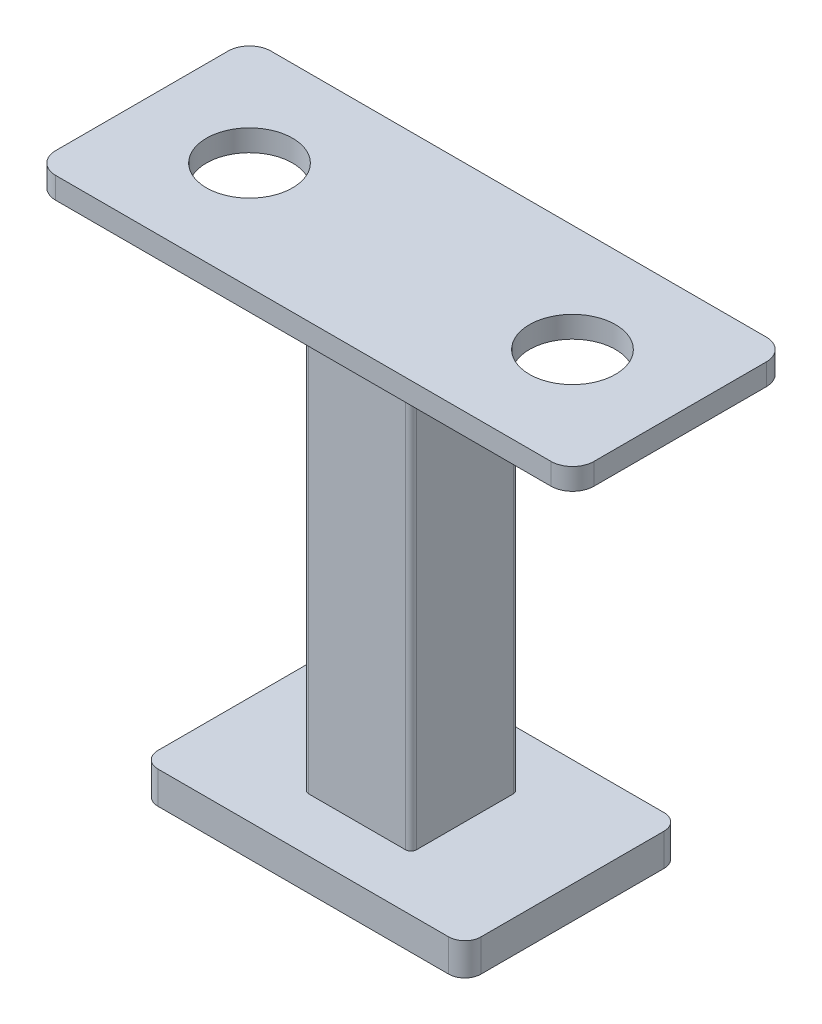
ISO-10303-21;
HEADER;
FILE_DESCRIPTION(('STEP AP214'),'2;1');
FILE_NAME('part.step','',(''),(''),'','','');
FILE_SCHEMA(('AUTOMOTIVE_DESIGN { 1 0 10303 214 1 1 1 1 }'));
ENDSEC;
DATA;
#1=APPLICATION_CONTEXT('core data for automotive mechanical design processes');
#2=APPLICATION_PROTOCOL_DEFINITION('international standard','automotive_design',2000,#1);
#3=PRODUCT_CONTEXT('',#1,'mechanical');
#4=PRODUCT('Part','Part','',(#3));
#5=PRODUCT_RELATED_PRODUCT_CATEGORY('part','',(#4));
#6=PRODUCT_DEFINITION_FORMATION('','',#4);
#7=PRODUCT_DEFINITION_CONTEXT('part definition',#1,'design');
#8=PRODUCT_DEFINITION('design','',#6,#7);
#9=PRODUCT_DEFINITION_SHAPE('','',#8);
#10=(LENGTH_UNIT() NAMED_UNIT(*) SI_UNIT(.MILLI.,.METRE.));
#11=(NAMED_UNIT(*) PLANE_ANGLE_UNIT() SI_UNIT($,.RADIAN.));
#12=(NAMED_UNIT(*) SI_UNIT($,.STERADIAN.) SOLID_ANGLE_UNIT());
#13=UNCERTAINTY_MEASURE_WITH_UNIT(LENGTH_MEASURE(1.E-05),#10,'distance_accuracy_value','');
#14=(GEOMETRIC_REPRESENTATION_CONTEXT(3) GLOBAL_UNCERTAINTY_ASSIGNED_CONTEXT((#13)) GLOBAL_UNIT_ASSIGNED_CONTEXT((#10,
#11,#12)) REPRESENTATION_CONTEXT('',''));
#15=CARTESIAN_POINT('',(0.,0.,0.));
#16=DIRECTION('',(0.,0.,1.));
#17=DIRECTION('',(1.,0.,0.));
#18=AXIS2_PLACEMENT_3D('',#15,#16,#17);
#19=CARTESIAN_POINT('',(28.5,3.,-18.5));
#20=DIRECTION('',(0.,1.,0.));
#21=DIRECTION('',(0.,0.,1.));
#22=AXIS2_PLACEMENT_3D('',#19,#20,#21);
#23=PLANE('',#22);
#24=CARTESIAN_POINT('',(28.5,3.,-18.5));
#25=DIRECTION('',(0.,1.,0.));
#26=DIRECTION('',(0.,0.,1.));
#27=AXIS2_PLACEMENT_3D('',#24,#25,#26);
#28=CIRCLE('',#27,1.5);
#29=CARTESIAN_POINT('',(30.,3.,-18.5));
#30=VERTEX_POINT('',#29);
#31=CARTESIAN_POINT('',(28.5,3.,-20.));
#32=VERTEX_POINT('',#31);
#33=EDGE_CURVE('E184',#30,#32,#28,.T.);
#34=ORIENTED_EDGE('',*,*,#33,.T.);
#35=DIRECTION('',(-1.,0.,0.));
#36=VECTOR('',#35,1.);
#37=CARTESIAN_POINT('',(28.5,3.,-20.));
#38=LINE('',#37,#36);
#39=CARTESIAN_POINT('',(1.50000000000001,3.,-20.));
#40=VERTEX_POINT('',#39);
#41=EDGE_CURVE('E111',#32,#40,#38,.T.);
#42=ORIENTED_EDGE('',*,*,#41,.T.);
#43=CARTESIAN_POINT('',(1.5,3.,-18.5));
#44=DIRECTION('',(0.,1.,0.));
#45=DIRECTION('',(0.,0.,1.));
#46=AXIS2_PLACEMENT_3D('',#43,#44,#45);
#47=CIRCLE('',#46,1.5);
#48=CARTESIAN_POINT('',(0.,3.,-18.5));
#49=VERTEX_POINT('',#48);
#50=EDGE_CURVE('E204',#40,#49,#47,.T.);
#51=ORIENTED_EDGE('',*,*,#50,.T.);
#52=DIRECTION('',(0.,0.,1.));
#53=VECTOR('',#52,1.);
#54=CARTESIAN_POINT('',(0.,3.,-18.5));
#55=LINE('',#54,#53);
#56=CARTESIAN_POINT('',(0.,3.,-1.50000000000001));
#57=VERTEX_POINT('',#56);
#58=EDGE_CURVE('E214',#49,#57,#55,.T.);
#59=ORIENTED_EDGE('',*,*,#58,.T.);
#60=CARTESIAN_POINT('',(1.5,3.,-1.5));
#61=DIRECTION('',(0.,-1.,0.));
#62=DIRECTION('',(0.,0.,-1.));
#63=AXIS2_PLACEMENT_3D('',#60,#61,#62);
#64=CIRCLE('',#63,1.5);
#65=CARTESIAN_POINT('',(1.50000000000001,3.,0.));
#66=VERTEX_POINT('',#65);
#67=EDGE_CURVE('E134',#66,#57,#64,.T.);
#68=ORIENTED_EDGE('',*,*,#67,.F.);
#69=DIRECTION('',(1.,0.,0.));
#70=VECTOR('',#69,1.);
#71=CARTESIAN_POINT('',(1.50000000000001,3.,0.));
#72=LINE('',#71,#70);
#73=CARTESIAN_POINT('',(28.5,3.,0.));
#74=VERTEX_POINT('',#73);
#75=EDGE_CURVE('E128',#66,#74,#72,.T.);
#76=ORIENTED_EDGE('',*,*,#75,.T.);
#77=CARTESIAN_POINT('',(28.5,3.,-1.5));
#78=DIRECTION('',(0.,-1.,0.));
#79=DIRECTION('',(0.,0.,-1.));
#80=AXIS2_PLACEMENT_3D('',#77,#78,#79);
#81=CIRCLE('',#80,1.5);
#82=CARTESIAN_POINT('',(30.,3.,-1.50000000000001));
#83=VERTEX_POINT('',#82);
#84=EDGE_CURVE('E132',#83,#74,#81,.T.);
#85=ORIENTED_EDGE('',*,*,#84,.F.);
#86=DIRECTION('',(0.,0.,-1.));
#87=VECTOR('',#86,1.);
#88=CARTESIAN_POINT('',(30.,3.,-1.50000000000001));
#89=LINE('',#88,#87);
#90=EDGE_CURVE('E70',#83,#30,#89,.T.);
#91=ORIENTED_EDGE('',*,*,#90,.T.);
#92=EDGE_LOOP('',(#34,#42,#51,#59,#68,#76,#85,#91));
#93=FACE_BOUND('',#92,.T.);
#94=DIRECTION('',(-1.,0.,0.));
#95=VECTOR('',#94,1.);
#96=CARTESIAN_POINT('',(10.5,3.,-15.));
#97=LINE('',#96,#95);
#98=CARTESIAN_POINT('',(19.5,3.,-15.));
#99=VERTEX_POINT('',#98);
#100=CARTESIAN_POINT('',(10.5,3.,-15.));
#101=VERTEX_POINT('',#100);
#102=EDGE_CURVE('E278',#99,#101,#97,.T.);
#103=ORIENTED_EDGE('',*,*,#102,.F.);
#104=CARTESIAN_POINT('',(19.5,3.,-14.5));
#105=DIRECTION('',(0.,1.,0.));
#106=DIRECTION('',(0.,0.,1.));
#107=AXIS2_PLACEMENT_3D('',#104,#105,#106);
#108=CIRCLE('',#107,0.5);
#109=CARTESIAN_POINT('',(20.,3.,-14.5));
#110=VERTEX_POINT('',#109);
#111=EDGE_CURVE('E282',#110,#99,#108,.T.);
#112=ORIENTED_EDGE('',*,*,#111,.F.);
#113=DIRECTION('',(0.,0.,-1.));
#114=VECTOR('',#113,1.);
#115=CARTESIAN_POINT('',(20.,3.,-5.50000000000001));
#116=LINE('',#115,#114);
#117=CARTESIAN_POINT('',(20.,3.,-5.50000000000001));
#118=VERTEX_POINT('',#117);
#119=EDGE_CURVE('E255',#118,#110,#116,.T.);
#120=ORIENTED_EDGE('',*,*,#119,.F.);
#121=CARTESIAN_POINT('',(19.5,3.,-5.50000000000001));
#122=DIRECTION('',(0.,1.,0.));
#123=DIRECTION('',(0.,0.,-1.));
#124=AXIS2_PLACEMENT_3D('',#121,#122,#123);
#125=CIRCLE('',#124,0.5);
#126=CARTESIAN_POINT('',(19.5,3.,-5.));
#127=VERTEX_POINT('',#126);
#128=EDGE_CURVE('E259',#127,#118,#125,.T.);
#129=ORIENTED_EDGE('',*,*,#128,.F.);
#130=DIRECTION('',(1.,0.,0.));
#131=VECTOR('',#130,1.);
#132=CARTESIAN_POINT('',(10.5,3.,-5.));
#133=LINE('',#132,#131);
#134=CARTESIAN_POINT('',(10.5,3.,-5.));
#135=VERTEX_POINT('',#134);
#136=EDGE_CURVE('E262',#135,#127,#133,.T.);
#137=ORIENTED_EDGE('',*,*,#136,.F.);
#138=CARTESIAN_POINT('',(10.5,3.,-5.5));
#139=DIRECTION('',(0.,1.,0.));
#140=DIRECTION('',(0.,0.,-1.));
#141=AXIS2_PLACEMENT_3D('',#138,#139,#140);
#142=CIRCLE('',#141,0.5);
#143=CARTESIAN_POINT('',(10.,3.,-5.50000000000001));
#144=VERTEX_POINT('',#143);
#145=EDGE_CURVE('E266',#144,#135,#142,.T.);
#146=ORIENTED_EDGE('',*,*,#145,.F.);
#147=DIRECTION('',(0.,0.,1.));
#148=VECTOR('',#147,1.);
#149=CARTESIAN_POINT('',(10.,3.,-5.50000000000001));
#150=LINE('',#149,#148);
#151=CARTESIAN_POINT('',(10.,3.,-14.5));
#152=VERTEX_POINT('',#151);
#153=EDGE_CURVE('E270',#152,#144,#150,.T.);
#154=ORIENTED_EDGE('',*,*,#153,.F.);
#155=CARTESIAN_POINT('',(10.5,3.,-14.5));
#156=DIRECTION('',(0.,1.,0.));
#157=DIRECTION('',(0.,0.,1.));
#158=AXIS2_PLACEMENT_3D('',#155,#156,#157);
#159=CIRCLE('',#158,0.5);
#160=EDGE_CURVE('E274',#101,#152,#159,.T.);
#161=ORIENTED_EDGE('',*,*,#160,.F.);
#162=EDGE_LOOP('',(#103,#112,#120,#129,#137,#146,#154,#161));
#163=FACE_BOUND('',#162,.T.);
#164=ADVANCED_FACE('F45',(#93,#163),#23,.T.);
#165=CARTESIAN_POINT('',(28.5,3.,-18.5));
#166=DIRECTION('',(0.,-1.,0.));
#167=DIRECTION('',(0.,0.,-1.));
#168=AXIS2_PLACEMENT_3D('',#165,#166,#167);
#169=CYLINDRICAL_SURFACE('',#168,1.5);
#170=CARTESIAN_POINT('',(28.5,0.,-18.5));
#171=DIRECTION('',(0.,1.,0.));
#172=DIRECTION('',(0.,0.,1.));
#173=AXIS2_PLACEMENT_3D('',#170,#171,#172);
#174=CIRCLE('',#173,1.5);
#175=CARTESIAN_POINT('',(30.,0.,-18.5));
#176=VERTEX_POINT('',#175);
#177=CARTESIAN_POINT('',(28.5,0.,-20.));
#178=VERTEX_POINT('',#177);
#179=EDGE_CURVE('E158',#176,#178,#174,.T.);
#180=ORIENTED_EDGE('',*,*,#179,.T.);
#181=DIRECTION('',(0.,-1.,0.));
#182=VECTOR('',#181,1.);
#183=CARTESIAN_POINT('',(28.5,3.,-20.));
#184=LINE('',#183,#182);
#185=EDGE_CURVE('E11',#32,#178,#184,.T.);
#186=ORIENTED_EDGE('',*,*,#185,.F.);
#187=ORIENTED_EDGE('',*,*,#33,.F.);
#188=DIRECTION('',(0.,-1.,0.));
#189=VECTOR('',#188,1.);
#190=CARTESIAN_POINT('',(30.,3.,-18.5));
#191=LINE('',#190,#189);
#192=EDGE_CURVE('E154',#30,#176,#191,.T.);
#193=ORIENTED_EDGE('',*,*,#192,.T.);
#194=EDGE_LOOP('',(#180,#186,#187,#193));
#195=FACE_BOUND('',#194,.T.);
#196=ADVANCED_FACE('F47',(#195),#169,.T.);
#197=CARTESIAN_POINT('',(28.5,3.,-20.));
#198=DIRECTION('',(0.,0.,1.));
#199=DIRECTION('',(1.,0.,0.));
#200=AXIS2_PLACEMENT_3D('',#197,#198,#199);
#201=PLANE('',#200);
#202=DIRECTION('',(-1.,0.,0.));
#203=VECTOR('',#202,1.);
#204=CARTESIAN_POINT('',(28.5,0.,-20.));
#205=LINE('',#204,#203);
#206=CARTESIAN_POINT('',(1.50000000000001,0.,-20.));
#207=VERTEX_POINT('',#206);
#208=EDGE_CURVE('E162',#178,#207,#205,.T.);
#209=ORIENTED_EDGE('',*,*,#208,.T.);
#210=DIRECTION('',(0.,-1.,0.));
#211=VECTOR('',#210,1.);
#212=CARTESIAN_POINT('',(1.50000000000001,3.,-20.));
#213=LINE('',#212,#211);
#214=EDGE_CURVE('E54',#40,#207,#213,.T.);
#215=ORIENTED_EDGE('',*,*,#214,.F.);
#216=ORIENTED_EDGE('',*,*,#41,.F.);
#217=ORIENTED_EDGE('',*,*,#185,.T.);
#218=EDGE_LOOP('',(#209,#215,#216,#217));
#219=FACE_BOUND('',#218,.T.);
#220=ADVANCED_FACE('F556',(#219),#201,.F.);
#221=CARTESIAN_POINT('',(1.5,3.,-18.5));
#222=DIRECTION('',(0.,-1.,0.));
#223=DIRECTION('',(0.,0.,-1.));
#224=AXIS2_PLACEMENT_3D('',#221,#222,#223);
#225=CYLINDRICAL_SURFACE('',#224,1.5);
#226=CARTESIAN_POINT('',(1.5,0.,-18.5));
#227=DIRECTION('',(0.,1.,0.));
#228=DIRECTION('',(0.,0.,1.));
#229=AXIS2_PLACEMENT_3D('',#226,#227,#228);
#230=CIRCLE('',#229,1.5);
#231=CARTESIAN_POINT('',(0.,0.,-18.5));
#232=VERTEX_POINT('',#231);
#233=EDGE_CURVE('E166',#207,#232,#230,.T.);
#234=ORIENTED_EDGE('',*,*,#233,.T.);
#235=DIRECTION('',(0.,-1.,0.));
#236=VECTOR('',#235,1.);
#237=CARTESIAN_POINT('',(0.,3.,-18.5));
#238=LINE('',#237,#236);
#239=EDGE_CURVE('E194',#49,#232,#238,.T.);
#240=ORIENTED_EDGE('',*,*,#239,.F.);
#241=ORIENTED_EDGE('',*,*,#50,.F.);
#242=ORIENTED_EDGE('',*,*,#214,.T.);
#243=EDGE_LOOP('',(#234,#240,#241,#242));
#244=FACE_BOUND('',#243,.T.);
#245=ADVANCED_FACE('F202',(#244),#225,.T.);
#246=CARTESIAN_POINT('',(0.,3.,-18.5));
#247=DIRECTION('',(1.,0.,0.));
#248=DIRECTION('',(0.,0.,-1.));
#249=AXIS2_PLACEMENT_3D('',#246,#247,#248);
#250=PLANE('',#249);
#251=DIRECTION('',(0.,0.,1.));
#252=VECTOR('',#251,1.);
#253=CARTESIAN_POINT('',(0.,0.,-18.5));
#254=LINE('',#253,#252);
#255=CARTESIAN_POINT('',(0.,0.,-1.50000000000001));
#256=VERTEX_POINT('',#255);
#257=EDGE_CURVE('E169',#232,#256,#254,.T.);
#258=ORIENTED_EDGE('',*,*,#257,.T.);
#259=DIRECTION('',(0.,-1.,0.));
#260=VECTOR('',#259,1.);
#261=CARTESIAN_POINT('',(0.,3.,-1.50000000000001));
#262=LINE('',#261,#260);
#263=EDGE_CURVE('E191',#57,#256,#262,.T.);
#264=ORIENTED_EDGE('',*,*,#263,.F.);
#265=ORIENTED_EDGE('',*,*,#58,.F.);
#266=ORIENTED_EDGE('',*,*,#239,.T.);
#267=EDGE_LOOP('',(#258,#264,#265,#266));
#268=FACE_BOUND('',#267,.T.);
#269=ADVANCED_FACE('F212',(#268),#250,.F.);
#270=CARTESIAN_POINT('',(1.5,3.,-1.5));
#271=DIRECTION('',(0.,-1.,0.));
#272=DIRECTION('',(0.,0.,-1.));
#273=AXIS2_PLACEMENT_3D('',#270,#271,#272);
#274=CYLINDRICAL_SURFACE('',#273,1.5);
#275=CARTESIAN_POINT('',(1.5,0.,-1.5));
#276=DIRECTION('',(0.,-1.,0.));
#277=DIRECTION('',(0.,0.,-1.));
#278=AXIS2_PLACEMENT_3D('',#275,#276,#277);
#279=CIRCLE('',#278,1.5);
#280=CARTESIAN_POINT('',(1.50000000000001,0.,0.));
#281=VERTEX_POINT('',#280);
#282=EDGE_CURVE('E173',#281,#256,#279,.T.);
#283=ORIENTED_EDGE('',*,*,#282,.F.);
#284=DIRECTION('',(0.,-1.,0.));
#285=VECTOR('',#284,1.);
#286=CARTESIAN_POINT('',(1.50000000000001,3.,0.));
#287=LINE('',#286,#285);
#288=EDGE_CURVE('E147',#66,#281,#287,.T.);
#289=ORIENTED_EDGE('',*,*,#288,.F.);
#290=ORIENTED_EDGE('',*,*,#67,.T.);
#291=ORIENTED_EDGE('',*,*,#263,.T.);
#292=EDGE_LOOP('',(#283,#289,#290,#291));
#293=FACE_BOUND('',#292,.T.);
#294=ADVANCED_FACE('F569',(#293),#274,.T.);
#295=CARTESIAN_POINT('',(1.50000000000001,3.,0.));
#296=DIRECTION('',(0.,0.,-1.));
#297=DIRECTION('',(-1.,0.,0.));
#298=AXIS2_PLACEMENT_3D('',#295,#296,#297);
#299=PLANE('',#298);
#300=DIRECTION('',(1.,0.,0.));
#301=VECTOR('',#300,1.);
#302=CARTESIAN_POINT('',(1.50000000000001,0.,0.));
#303=LINE('',#302,#301);
#304=CARTESIAN_POINT('',(28.5,0.,0.));
#305=VERTEX_POINT('',#304);
#306=EDGE_CURVE('E142',#281,#305,#303,.T.);
#307=ORIENTED_EDGE('',*,*,#306,.T.);
#308=DIRECTION('',(0.,-1.,0.));
#309=VECTOR('',#308,1.);
#310=CARTESIAN_POINT('',(28.5,3.,0.));
#311=LINE('',#310,#309);
#312=EDGE_CURVE('E139',#74,#305,#311,.T.);
#313=ORIENTED_EDGE('',*,*,#312,.F.);
#314=ORIENTED_EDGE('',*,*,#75,.F.);
#315=ORIENTED_EDGE('',*,*,#288,.T.);
#316=EDGE_LOOP('',(#307,#313,#314,#315));
#317=FACE_BOUND('',#316,.T.);
#318=ADVANCED_FACE('F140',(#317),#299,.F.);
#319=CARTESIAN_POINT('',(28.5,3.,-1.5));
#320=DIRECTION('',(0.,-1.,0.));
#321=DIRECTION('',(0.,0.,-1.));
#322=AXIS2_PLACEMENT_3D('',#319,#320,#321);
#323=CYLINDRICAL_SURFACE('',#322,1.5);
#324=CARTESIAN_POINT('',(28.5,0.,-1.5));
#325=DIRECTION('',(0.,-1.,0.));
#326=DIRECTION('',(0.,0.,-1.));
#327=AXIS2_PLACEMENT_3D('',#324,#325,#326);
#328=CIRCLE('',#327,1.5);
#329=CARTESIAN_POINT('',(30.,0.,-1.50000000000001));
#330=VERTEX_POINT('',#329);
#331=EDGE_CURVE('E179',#330,#305,#328,.T.);
#332=ORIENTED_EDGE('',*,*,#331,.F.);
#333=DIRECTION('',(0.,-1.,0.));
#334=VECTOR('',#333,1.);
#335=CARTESIAN_POINT('',(30.,3.,-1.50000000000001));
#336=LINE('',#335,#334);
#337=EDGE_CURVE('E148',#83,#330,#336,.T.);
#338=ORIENTED_EDGE('',*,*,#337,.F.);
#339=ORIENTED_EDGE('',*,*,#84,.T.);
#340=ORIENTED_EDGE('',*,*,#312,.T.);
#341=EDGE_LOOP('',(#332,#338,#339,#340));
#342=FACE_BOUND('',#341,.T.);
#343=ADVANCED_FACE('F150',(#342),#323,.T.);
#344=CARTESIAN_POINT('',(30.,3.,-1.50000000000001));
#345=DIRECTION('',(-1.,0.,0.));
#346=DIRECTION('',(0.,0.,1.));
#347=AXIS2_PLACEMENT_3D('',#344,#345,#346);
#348=PLANE('',#347);
#349=DIRECTION('',(0.,0.,-1.));
#350=VECTOR('',#349,1.);
#351=CARTESIAN_POINT('',(30.,0.,-1.50000000000001));
#352=LINE('',#351,#350);
#353=EDGE_CURVE('E103',#330,#176,#352,.T.);
#354=ORIENTED_EDGE('',*,*,#353,.T.);
#355=ORIENTED_EDGE('',*,*,#192,.F.);
#356=ORIENTED_EDGE('',*,*,#90,.F.);
#357=ORIENTED_EDGE('',*,*,#337,.T.);
#358=EDGE_LOOP('',(#354,#355,#356,#357));
#359=FACE_BOUND('',#358,.T.);
#360=ADVANCED_FACE('F562',(#359),#348,.F.);
#361=CARTESIAN_POINT('',(28.5,0.,-18.5));
#362=DIRECTION('',(0.,1.,0.));
#363=DIRECTION('',(0.,0.,1.));
#364=AXIS2_PLACEMENT_3D('',#361,#362,#363);
#365=PLANE('',#364);
#366=ORIENTED_EDGE('',*,*,#179,.F.);
#367=ORIENTED_EDGE('',*,*,#353,.F.);
#368=ORIENTED_EDGE('',*,*,#331,.T.);
#369=ORIENTED_EDGE('',*,*,#306,.F.);
#370=ORIENTED_EDGE('',*,*,#282,.T.);
#371=ORIENTED_EDGE('',*,*,#257,.F.);
#372=ORIENTED_EDGE('',*,*,#233,.F.);
#373=ORIENTED_EDGE('',*,*,#208,.F.);
#374=EDGE_LOOP('',(#366,#367,#368,#369,#370,#371,#372,#373));
#375=FACE_BOUND('',#374,.T.);
#376=ADVANCED_FACE('F208',(#375),#365,.F.);
#377=CARTESIAN_POINT('',(19.5,44.,-14.5));
#378=DIRECTION('',(0.,-1.,0.));
#379=DIRECTION('',(0.,0.,-1.));
#380=AXIS2_PLACEMENT_3D('',#377,#378,#379);
#381=CYLINDRICAL_SURFACE('',#380,0.5);
#382=ORIENTED_EDGE('',*,*,#111,.T.);
#383=DIRECTION('',(0.,-1.,0.));
#384=VECTOR('',#383,1.);
#385=CARTESIAN_POINT('',(19.5,44.,-15.));
#386=LINE('',#385,#384);
#387=CARTESIAN_POINT('',(19.5,44.,-15.));
#388=VERTEX_POINT('',#387);
#389=EDGE_CURVE('E163',#388,#99,#386,.T.);
#390=ORIENTED_EDGE('',*,*,#389,.F.);
#391=CARTESIAN_POINT('',(19.5,44.,-14.5));
#392=DIRECTION('',(0.,1.,0.));
#393=DIRECTION('',(0.,0.,1.));
#394=AXIS2_PLACEMENT_3D('',#391,#392,#393);
#395=CIRCLE('',#394,0.5);
#396=CARTESIAN_POINT('',(20.,44.,-14.5));
#397=VERTEX_POINT('',#396);
#398=EDGE_CURVE('E258',#397,#388,#395,.T.);
#399=ORIENTED_EDGE('',*,*,#398,.F.);
#400=DIRECTION('',(0.,-1.,0.));
#401=VECTOR('',#400,1.);
#402=CARTESIAN_POINT('',(20.,44.,-14.5));
#403=LINE('',#402,#401);
#404=EDGE_CURVE('E250',#397,#110,#403,.T.);
#405=ORIENTED_EDGE('',*,*,#404,.T.);
#406=EDGE_LOOP('',(#382,#390,#399,#405));
#407=FACE_BOUND('',#406,.T.);
#408=ADVANCED_FACE('F517',(#407),#381,.T.);
#409=CARTESIAN_POINT('',(10.5,44.,-15.));
#410=DIRECTION('',(0.,0.,1.));
#411=DIRECTION('',(1.,0.,0.));
#412=AXIS2_PLACEMENT_3D('',#409,#410,#411);
#413=PLANE('',#412);
#414=ORIENTED_EDGE('',*,*,#102,.T.);
#415=DIRECTION('',(0.,-1.,0.));
#416=VECTOR('',#415,1.);
#417=CARTESIAN_POINT('',(10.5,44.,-15.));
#418=LINE('',#417,#416);
#419=CARTESIAN_POINT('',(10.5,44.,-15.));
#420=VERTEX_POINT('',#419);
#421=EDGE_CURVE('E228',#420,#101,#418,.T.);
#422=ORIENTED_EDGE('',*,*,#421,.F.);
#423=DIRECTION('',(-1.,0.,0.));
#424=VECTOR('',#423,1.);
#425=CARTESIAN_POINT('',(10.5,44.,-15.));
#426=LINE('',#425,#424);
#427=EDGE_CURVE('E310',#388,#420,#426,.T.);
#428=ORIENTED_EDGE('',*,*,#427,.F.);
#429=ORIENTED_EDGE('',*,*,#389,.T.);
#430=EDGE_LOOP('',(#414,#422,#428,#429));
#431=FACE_BOUND('',#430,.T.);
#432=ADVANCED_FACE('F523',(#431),#413,.F.);
#433=CARTESIAN_POINT('',(10.5,44.,-14.5));
#434=DIRECTION('',(0.,-1.,0.));
#435=DIRECTION('',(0.,0.,-1.));
#436=AXIS2_PLACEMENT_3D('',#433,#434,#435);
#437=CYLINDRICAL_SURFACE('',#436,0.5);
#438=ORIENTED_EDGE('',*,*,#160,.T.);
#439=DIRECTION('',(0.,-1.,0.));
#440=VECTOR('',#439,1.);
#441=CARTESIAN_POINT('',(10.,44.,-14.5));
#442=LINE('',#441,#440);
#443=CARTESIAN_POINT('',(10.,44.,-14.5));
#444=VERTEX_POINT('',#443);
#445=EDGE_CURVE('E232',#444,#152,#442,.T.);
#446=ORIENTED_EDGE('',*,*,#445,.F.);
#447=CARTESIAN_POINT('',(10.5,44.,-14.5));
#448=DIRECTION('',(0.,1.,0.));
#449=DIRECTION('',(0.,0.,1.));
#450=AXIS2_PLACEMENT_3D('',#447,#448,#449);
#451=CIRCLE('',#450,0.5);
#452=EDGE_CURVE('E306',#420,#444,#451,.T.);
#453=ORIENTED_EDGE('',*,*,#452,.F.);
#454=ORIENTED_EDGE('',*,*,#421,.T.);
#455=EDGE_LOOP('',(#438,#446,#453,#454));
#456=FACE_BOUND('',#455,.T.);
#457=ADVANCED_FACE('F526',(#456),#437,.T.);
#458=CARTESIAN_POINT('',(10.,44.,-5.50000000000001));
#459=DIRECTION('',(1.,0.,0.));
#460=DIRECTION('',(0.,0.,-1.));
#461=AXIS2_PLACEMENT_3D('',#458,#459,#460);
#462=PLANE('',#461);
#463=ORIENTED_EDGE('',*,*,#153,.T.);
#464=DIRECTION('',(0.,-1.,0.));
#465=VECTOR('',#464,1.);
#466=CARTESIAN_POINT('',(10.,44.,-5.50000000000001));
#467=LINE('',#466,#465);
#468=CARTESIAN_POINT('',(10.,44.,-5.50000000000001));
#469=VERTEX_POINT('',#468);
#470=EDGE_CURVE('E236',#469,#144,#467,.T.);
#471=ORIENTED_EDGE('',*,*,#470,.F.);
#472=DIRECTION('',(0.,0.,1.));
#473=VECTOR('',#472,1.);
#474=CARTESIAN_POINT('',(10.,44.,-5.50000000000001));
#475=LINE('',#474,#473);
#476=EDGE_CURVE('E302',#444,#469,#475,.T.);
#477=ORIENTED_EDGE('',*,*,#476,.F.);
#478=ORIENTED_EDGE('',*,*,#445,.T.);
#479=EDGE_LOOP('',(#463,#471,#477,#478));
#480=FACE_BOUND('',#479,.T.);
#481=ADVANCED_FACE('F540',(#480),#462,.F.);
#482=CARTESIAN_POINT('',(10.5,44.,-5.5));
#483=DIRECTION('',(0.,-1.,0.));
#484=DIRECTION('',(0.,0.,-1.));
#485=AXIS2_PLACEMENT_3D('',#482,#483,#484);
#486=CYLINDRICAL_SURFACE('',#485,0.5);
#487=ORIENTED_EDGE('',*,*,#145,.T.);
#488=DIRECTION('',(0.,-1.,0.));
#489=VECTOR('',#488,1.);
#490=CARTESIAN_POINT('',(10.5,44.,-5.));
#491=LINE('',#490,#489);
#492=CARTESIAN_POINT('',(10.5,44.,-5.));
#493=VERTEX_POINT('',#492);
#494=EDGE_CURVE('E240',#493,#135,#491,.T.);
#495=ORIENTED_EDGE('',*,*,#494,.F.);
#496=CARTESIAN_POINT('',(10.5,44.,-5.5));
#497=DIRECTION('',(0.,1.,0.));
#498=DIRECTION('',(0.,0.,-1.));
#499=AXIS2_PLACEMENT_3D('',#496,#497,#498);
#500=CIRCLE('',#499,0.5);
#501=EDGE_CURVE('E298',#469,#493,#500,.T.);
#502=ORIENTED_EDGE('',*,*,#501,.F.);
#503=ORIENTED_EDGE('',*,*,#470,.T.);
#504=EDGE_LOOP('',(#487,#495,#502,#503));
#505=FACE_BOUND('',#504,.T.);
#506=ADVANCED_FACE('F536',(#505),#486,.T.);
#507=CARTESIAN_POINT('',(10.5,44.,-5.));
#508=DIRECTION('',(0.,0.,-1.));
#509=DIRECTION('',(-1.,0.,0.));
#510=AXIS2_PLACEMENT_3D('',#507,#508,#509);
#511=PLANE('',#510);
#512=ORIENTED_EDGE('',*,*,#136,.T.);
#513=DIRECTION('',(0.,-1.,0.));
#514=VECTOR('',#513,1.);
#515=CARTESIAN_POINT('',(19.5,44.,-5.));
#516=LINE('',#515,#514);
#517=CARTESIAN_POINT('',(19.5,44.,-5.));
#518=VERTEX_POINT('',#517);
#519=EDGE_CURVE('E244',#518,#127,#516,.T.);
#520=ORIENTED_EDGE('',*,*,#519,.F.);
#521=DIRECTION('',(1.,0.,0.));
#522=VECTOR('',#521,1.);
#523=CARTESIAN_POINT('',(10.5,44.,-5.));
#524=LINE('',#523,#522);
#525=EDGE_CURVE('E294',#493,#518,#524,.T.);
#526=ORIENTED_EDGE('',*,*,#525,.F.);
#527=ORIENTED_EDGE('',*,*,#494,.T.);
#528=EDGE_LOOP('',(#512,#520,#526,#527));
#529=FACE_BOUND('',#528,.T.);
#530=ADVANCED_FACE('F538',(#529),#511,.F.);
#531=CARTESIAN_POINT('',(19.5,44.,-5.50000000000001));
#532=DIRECTION('',(0.,-1.,0.));
#533=DIRECTION('',(0.,0.,-1.));
#534=AXIS2_PLACEMENT_3D('',#531,#532,#533);
#535=CYLINDRICAL_SURFACE('',#534,0.5);
#536=ORIENTED_EDGE('',*,*,#128,.T.);
#537=DIRECTION('',(0.,-1.,0.));
#538=VECTOR('',#537,1.);
#539=CARTESIAN_POINT('',(20.,44.,-5.50000000000001));
#540=LINE('',#539,#538);
#541=CARTESIAN_POINT('',(20.,44.,-5.50000000000001));
#542=VERTEX_POINT('',#541);
#543=EDGE_CURVE('E61',#542,#118,#540,.T.);
#544=ORIENTED_EDGE('',*,*,#543,.F.);
#545=CARTESIAN_POINT('',(19.5,44.,-5.50000000000001));
#546=DIRECTION('',(0.,1.,0.));
#547=DIRECTION('',(0.,0.,-1.));
#548=AXIS2_PLACEMENT_3D('',#545,#546,#547);
#549=CIRCLE('',#548,0.5);
#550=EDGE_CURVE('E290',#518,#542,#549,.T.);
#551=ORIENTED_EDGE('',*,*,#550,.F.);
#552=ORIENTED_EDGE('',*,*,#519,.T.);
#553=EDGE_LOOP('',(#536,#544,#551,#552));
#554=FACE_BOUND('',#553,.T.);
#555=ADVANCED_FACE('F533',(#554),#535,.T.);
#556=CARTESIAN_POINT('',(20.,44.,-5.50000000000001));
#557=DIRECTION('',(-1.,0.,0.));
#558=DIRECTION('',(0.,0.,1.));
#559=AXIS2_PLACEMENT_3D('',#556,#557,#558);
#560=PLANE('',#559);
#561=ORIENTED_EDGE('',*,*,#119,.T.);
#562=ORIENTED_EDGE('',*,*,#404,.F.);
#563=DIRECTION('',(0.,0.,-1.));
#564=VECTOR('',#563,1.);
#565=CARTESIAN_POINT('',(20.,44.,-5.50000000000001));
#566=LINE('',#565,#564);
#567=EDGE_CURVE('E254',#542,#397,#566,.T.);
#568=ORIENTED_EDGE('',*,*,#567,.F.);
#569=ORIENTED_EDGE('',*,*,#543,.T.);
#570=EDGE_LOOP('',(#561,#562,#568,#569));
#571=FACE_BOUND('',#570,.T.);
#572=ADVANCED_FACE('F513',(#571),#560,.F.);
#573=CARTESIAN_POINT('',(38.,44.,-18.));
#574=DIRECTION('',(0.,1.,0.));
#575=DIRECTION('',(0.,0.,1.));
#576=AXIS2_PLACEMENT_3D('',#573,#574,#575);
#577=PLANE('',#576);
#578=CARTESIAN_POINT('',(0.,44.,-10.));
#579=DIRECTION('',(0.,1.,0.));
#580=DIRECTION('',(0.,0.,1.));
#581=AXIS2_PLACEMENT_3D('',#578,#579,#580);
#582=CIRCLE('',#581,4.);
#583=CARTESIAN_POINT('',(0.,44.,-6.00000000000001));
#584=VERTEX_POINT('',#583);
#585=EDGE_CURVE('E382',#584,#584,#582,.T.);
#586=ORIENTED_EDGE('',*,*,#585,.T.);
#587=EDGE_LOOP('',(#586));
#588=FACE_BOUND('',#587,.T.);
#589=CARTESIAN_POINT('',(30.,44.,-10.));
#590=DIRECTION('',(0.,1.,0.));
#591=DIRECTION('',(0.,0.,1.));
#592=AXIS2_PLACEMENT_3D('',#589,#590,#591);
#593=CIRCLE('',#592,4.00000000000001);
#594=CARTESIAN_POINT('',(30.,44.,-6.));
#595=VERTEX_POINT('',#594);
#596=EDGE_CURVE('E416',#595,#595,#593,.T.);
#597=ORIENTED_EDGE('',*,*,#596,.T.);
#598=EDGE_LOOP('',(#597));
#599=FACE_BOUND('',#598,.T.);
#600=CARTESIAN_POINT('',(38.,44.,-18.));
#601=DIRECTION('',(0.,1.,0.));
#602=DIRECTION('',(0.,0.,1.));
#603=AXIS2_PLACEMENT_3D('',#600,#601,#602);
#604=CIRCLE('',#603,2.);
#605=CARTESIAN_POINT('',(40.,44.,-18.));
#606=VERTEX_POINT('',#605);
#607=CARTESIAN_POINT('',(38.,44.,-20.));
#608=VERTEX_POINT('',#607);
#609=EDGE_CURVE('E378',#606,#608,#604,.T.);
#610=ORIENTED_EDGE('',*,*,#609,.F.);
#611=DIRECTION('',(0.,0.,-1.));
#612=VECTOR('',#611,1.);
#613=CARTESIAN_POINT('',(40.,44.,-18.));
#614=LINE('',#613,#612);
#615=CARTESIAN_POINT('',(40.,44.,-2.));
#616=VERTEX_POINT('',#615);
#617=EDGE_CURVE('E349',#616,#606,#614,.T.);
#618=ORIENTED_EDGE('',*,*,#617,.F.);
#619=CARTESIAN_POINT('',(38.,44.,-2.));
#620=DIRECTION('',(0.,1.,0.));
#621=DIRECTION('',(0.,0.,-1.));
#622=AXIS2_PLACEMENT_3D('',#619,#620,#621);
#623=CIRCLE('',#622,2.);
#624=CARTESIAN_POINT('',(38.,44.,0.));
#625=VERTEX_POINT('',#624);
#626=EDGE_CURVE('E354',#625,#616,#623,.T.);
#627=ORIENTED_EDGE('',*,*,#626,.F.);
#628=DIRECTION('',(1.,0.,0.));
#629=VECTOR('',#628,1.);
#630=CARTESIAN_POINT('',(-7.99999999999999,44.,0.));
#631=LINE('',#630,#629);
#632=CARTESIAN_POINT('',(-7.99999999999999,44.,0.));
#633=VERTEX_POINT('',#632);
#634=EDGE_CURVE('E358',#633,#625,#631,.T.);
#635=ORIENTED_EDGE('',*,*,#634,.F.);
#636=CARTESIAN_POINT('',(-7.99999999999999,44.,-2.));
#637=DIRECTION('',(0.,1.,0.));
#638=DIRECTION('',(0.,0.,-1.));
#639=AXIS2_PLACEMENT_3D('',#636,#637,#638);
#640=CIRCLE('',#639,2.);
#641=CARTESIAN_POINT('',(-9.99999999999999,44.,-2.));
#642=VERTEX_POINT('',#641);
#643=EDGE_CURVE('E362',#642,#633,#640,.T.);
#644=ORIENTED_EDGE('',*,*,#643,.F.);
#645=DIRECTION('',(0.,0.,1.));
#646=VECTOR('',#645,1.);
#647=CARTESIAN_POINT('',(-10.,44.,-18.));
#648=LINE('',#647,#646);
#649=CARTESIAN_POINT('',(-10.,44.,-18.));
#650=VERTEX_POINT('',#649);
#651=EDGE_CURVE('E366',#650,#642,#648,.T.);
#652=ORIENTED_EDGE('',*,*,#651,.F.);
#653=CARTESIAN_POINT('',(-8.,44.,-18.));
#654=DIRECTION('',(0.,1.,0.));
#655=DIRECTION('',(0.,0.,1.));
#656=AXIS2_PLACEMENT_3D('',#653,#654,#655);
#657=CIRCLE('',#656,2.);
#658=CARTESIAN_POINT('',(-8.,44.,-20.));
#659=VERTEX_POINT('',#658);
#660=EDGE_CURVE('E370',#659,#650,#657,.T.);
#661=ORIENTED_EDGE('',*,*,#660,.F.);
#662=DIRECTION('',(-1.,0.,0.));
#663=VECTOR('',#662,1.);
#664=CARTESIAN_POINT('',(-8.,44.,-20.));
#665=LINE('',#664,#663);
#666=EDGE_CURVE('E374',#608,#659,#665,.T.);
#667=ORIENTED_EDGE('',*,*,#666,.F.);
#668=EDGE_LOOP('',(#610,#618,#627,#635,#644,#652,#661,#667));
#669=FACE_BOUND('',#668,.T.);
#670=ORIENTED_EDGE('',*,*,#567,.T.);
#671=ORIENTED_EDGE('',*,*,#398,.T.);
#672=ORIENTED_EDGE('',*,*,#427,.T.);
#673=ORIENTED_EDGE('',*,*,#452,.T.);
#674=ORIENTED_EDGE('',*,*,#476,.T.);
#675=ORIENTED_EDGE('',*,*,#501,.T.);
#676=ORIENTED_EDGE('',*,*,#525,.T.);
#677=ORIENTED_EDGE('',*,*,#550,.T.);
#678=EDGE_LOOP('',(#670,#671,#672,#673,#674,#675,#676,#677));
#679=FACE_BOUND('',#678,.T.);
#680=ADVANCED_FACE('F529',(#588,#599,#669,#679),#577,.F.);
#681=CARTESIAN_POINT('',(38.,46.,-18.));
#682=DIRECTION('',(0.,-1.,0.));
#683=DIRECTION('',(0.,0.,-1.));
#684=AXIS2_PLACEMENT_3D('',#681,#682,#683);
#685=CYLINDRICAL_SURFACE('',#684,2.);
#686=ORIENTED_EDGE('',*,*,#609,.T.);
#687=DIRECTION('',(0.,-1.,0.));
#688=VECTOR('',#687,1.);
#689=CARTESIAN_POINT('',(38.,46.,-20.));
#690=LINE('',#689,#688);
#691=CARTESIAN_POINT('',(38.,46.,-20.));
#692=VERTEX_POINT('',#691);
#693=EDGE_CURVE('E286',#692,#608,#690,.T.);
#694=ORIENTED_EDGE('',*,*,#693,.F.);
#695=CARTESIAN_POINT('',(38.,46.,-18.));
#696=DIRECTION('',(0.,1.,0.));
#697=DIRECTION('',(0.,0.,1.));
#698=AXIS2_PLACEMENT_3D('',#695,#696,#697);
#699=CIRCLE('',#698,2.);
#700=CARTESIAN_POINT('',(40.,46.,-18.));
#701=VERTEX_POINT('',#700);
#702=EDGE_CURVE('E353',#701,#692,#699,.T.);
#703=ORIENTED_EDGE('',*,*,#702,.F.);
#704=DIRECTION('',(0.,-1.,0.));
#705=VECTOR('',#704,1.);
#706=CARTESIAN_POINT('',(40.,46.,-18.));
#707=LINE('',#706,#705);
#708=EDGE_CURVE('E344',#701,#606,#707,.T.);
#709=ORIENTED_EDGE('',*,*,#708,.T.);
#710=EDGE_LOOP('',(#686,#694,#703,#709));
#711=FACE_BOUND('',#710,.T.);
#712=ADVANCED_FACE('F452',(#711),#685,.T.);
#713=CARTESIAN_POINT('',(-8.,46.,-20.));
#714=DIRECTION('',(0.,0.,1.));
#715=DIRECTION('',(1.,0.,0.));
#716=AXIS2_PLACEMENT_3D('',#713,#714,#715);
#717=PLANE('',#716);
#718=ORIENTED_EDGE('',*,*,#666,.T.);
#719=DIRECTION('',(0.,-1.,0.));
#720=VECTOR('',#719,1.);
#721=CARTESIAN_POINT('',(-8.,46.,-20.));
#722=LINE('',#721,#720);
#723=CARTESIAN_POINT('',(-8.,46.,-20.));
#724=VERTEX_POINT('',#723);
#725=EDGE_CURVE('E320',#724,#659,#722,.T.);
#726=ORIENTED_EDGE('',*,*,#725,.F.);
#727=DIRECTION('',(-1.,0.,0.));
#728=VECTOR('',#727,1.);
#729=CARTESIAN_POINT('',(-8.,46.,-20.));
#730=LINE('',#729,#728);
#731=EDGE_CURVE('E406',#692,#724,#730,.T.);
#732=ORIENTED_EDGE('',*,*,#731,.F.);
#733=ORIENTED_EDGE('',*,*,#693,.T.);
#734=EDGE_LOOP('',(#718,#726,#732,#733));
#735=FACE_BOUND('',#734,.T.);
#736=ADVANCED_FACE('F456',(#735),#717,.F.);
#737=CARTESIAN_POINT('',(-8.,46.,-18.));
#738=DIRECTION('',(0.,-1.,0.));
#739=DIRECTION('',(0.,0.,-1.));
#740=AXIS2_PLACEMENT_3D('',#737,#738,#739);
#741=CYLINDRICAL_SURFACE('',#740,2.);
#742=ORIENTED_EDGE('',*,*,#660,.T.);
#743=DIRECTION('',(0.,-1.,0.));
#744=VECTOR('',#743,1.);
#745=CARTESIAN_POINT('',(-10.,46.,-18.));
#746=LINE('',#745,#744);
#747=CARTESIAN_POINT('',(-10.,46.,-18.));
#748=VERTEX_POINT('',#747);
#749=EDGE_CURVE('E324',#748,#650,#746,.T.);
#750=ORIENTED_EDGE('',*,*,#749,.F.);
#751=CARTESIAN_POINT('',(-8.,46.,-18.));
#752=DIRECTION('',(0.,1.,0.));
#753=DIRECTION('',(0.,0.,1.));
#754=AXIS2_PLACEMENT_3D('',#751,#752,#753);
#755=CIRCLE('',#754,2.);
#756=EDGE_CURVE('E402',#724,#748,#755,.T.);
#757=ORIENTED_EDGE('',*,*,#756,.F.);
#758=ORIENTED_EDGE('',*,*,#725,.T.);
#759=EDGE_LOOP('',(#742,#750,#757,#758));
#760=FACE_BOUND('',#759,.T.);
#761=ADVANCED_FACE('F703',(#760),#741,.T.);
#762=CARTESIAN_POINT('',(-10.,46.,-18.));
#763=DIRECTION('',(1.,0.,0.));
#764=DIRECTION('',(0.,0.,-1.));
#765=AXIS2_PLACEMENT_3D('',#762,#763,#764);
#766=PLANE('',#765);
#767=ORIENTED_EDGE('',*,*,#651,.T.);
#768=DIRECTION('',(0.,-1.,0.));
#769=VECTOR('',#768,1.);
#770=CARTESIAN_POINT('',(-9.99999999999999,46.,-2.));
#771=LINE('',#770,#769);
#772=CARTESIAN_POINT('',(-9.99999999999999,46.,-2.));
#773=VERTEX_POINT('',#772);
#774=EDGE_CURVE('E328',#773,#642,#771,.T.);
#775=ORIENTED_EDGE('',*,*,#774,.F.);
#776=DIRECTION('',(0.,0.,1.));
#777=VECTOR('',#776,1.);
#778=CARTESIAN_POINT('',(-10.,46.,-18.));
#779=LINE('',#778,#777);
#780=EDGE_CURVE('E398',#748,#773,#779,.T.);
#781=ORIENTED_EDGE('',*,*,#780,.F.);
#782=ORIENTED_EDGE('',*,*,#749,.T.);
#783=EDGE_LOOP('',(#767,#775,#781,#782));
#784=FACE_BOUND('',#783,.T.);
#785=ADVANCED_FACE('F712',(#784),#766,.F.);
#786=CARTESIAN_POINT('',(-7.99999999999999,46.,-2.));
#787=DIRECTION('',(0.,-1.,0.));
#788=DIRECTION('',(0.,0.,-1.));
#789=AXIS2_PLACEMENT_3D('',#786,#787,#788);
#790=CYLINDRICAL_SURFACE('',#789,2.);
#791=ORIENTED_EDGE('',*,*,#643,.T.);
#792=DIRECTION('',(0.,-1.,0.));
#793=VECTOR('',#792,1.);
#794=CARTESIAN_POINT('',(-7.99999999999999,46.,0.));
#795=LINE('',#794,#793);
#796=CARTESIAN_POINT('',(-7.99999999999999,46.,0.));
#797=VERTEX_POINT('',#796);
#798=EDGE_CURVE('E332',#797,#633,#795,.T.);
#799=ORIENTED_EDGE('',*,*,#798,.F.);
#800=CARTESIAN_POINT('',(-7.99999999999999,46.,-2.));
#801=DIRECTION('',(0.,1.,0.));
#802=DIRECTION('',(0.,0.,-1.));
#803=AXIS2_PLACEMENT_3D('',#800,#801,#802);
#804=CIRCLE('',#803,2.);
#805=EDGE_CURVE('E394',#773,#797,#804,.T.);
#806=ORIENTED_EDGE('',*,*,#805,.F.);
#807=ORIENTED_EDGE('',*,*,#774,.T.);
#808=EDGE_LOOP('',(#791,#799,#806,#807));
#809=FACE_BOUND('',#808,.T.);
#810=ADVANCED_FACE('F722',(#809),#790,.T.);
#811=CARTESIAN_POINT('',(-7.99999999999999,46.,0.));
#812=DIRECTION('',(0.,0.,-1.));
#813=DIRECTION('',(-1.,0.,0.));
#814=AXIS2_PLACEMENT_3D('',#811,#812,#813);
#815=PLANE('',#814);
#816=ORIENTED_EDGE('',*,*,#634,.T.);
#817=DIRECTION('',(0.,-1.,0.));
#818=VECTOR('',#817,1.);
#819=CARTESIAN_POINT('',(38.,46.,0.));
#820=LINE('',#819,#818);
#821=CARTESIAN_POINT('',(38.,46.,0.));
#822=VERTEX_POINT('',#821);
#823=EDGE_CURVE('E336',#822,#625,#820,.T.);
#824=ORIENTED_EDGE('',*,*,#823,.F.);
#825=DIRECTION('',(1.,0.,0.));
#826=VECTOR('',#825,1.);
#827=CARTESIAN_POINT('',(-7.99999999999999,46.,0.));
#828=LINE('',#827,#826);
#829=EDGE_CURVE('E390',#797,#822,#828,.T.);
#830=ORIENTED_EDGE('',*,*,#829,.F.);
#831=ORIENTED_EDGE('',*,*,#798,.T.);
#832=EDGE_LOOP('',(#816,#824,#830,#831));
#833=FACE_BOUND('',#832,.T.);
#834=ADVANCED_FACE('F732',(#833),#815,.F.);
#835=CARTESIAN_POINT('',(38.,46.,-2.));
#836=DIRECTION('',(0.,-1.,0.));
#837=DIRECTION('',(0.,0.,-1.));
#838=AXIS2_PLACEMENT_3D('',#835,#836,#837);
#839=CYLINDRICAL_SURFACE('',#838,2.);
#840=ORIENTED_EDGE('',*,*,#626,.T.);
#841=DIRECTION('',(0.,-1.,0.));
#842=VECTOR('',#841,1.);
#843=CARTESIAN_POINT('',(40.,46.,-2.));
#844=LINE('',#843,#842);
#845=CARTESIAN_POINT('',(40.,46.,-2.));
#846=VERTEX_POINT('',#845);
#847=EDGE_CURVE('E340',#846,#616,#844,.T.);
#848=ORIENTED_EDGE('',*,*,#847,.F.);
#849=CARTESIAN_POINT('',(38.,46.,-2.));
#850=DIRECTION('',(0.,1.,0.));
#851=DIRECTION('',(0.,0.,-1.));
#852=AXIS2_PLACEMENT_3D('',#849,#850,#851);
#853=CIRCLE('',#852,2.);
#854=EDGE_CURVE('E386',#822,#846,#853,.T.);
#855=ORIENTED_EDGE('',*,*,#854,.F.);
#856=ORIENTED_EDGE('',*,*,#823,.T.);
#857=EDGE_LOOP('',(#840,#848,#855,#856));
#858=FACE_BOUND('',#857,.T.);
#859=ADVANCED_FACE('F742',(#858),#839,.T.);
#860=CARTESIAN_POINT('',(40.,46.,-18.));
#861=DIRECTION('',(-1.,0.,0.));
#862=DIRECTION('',(0.,0.,1.));
#863=AXIS2_PLACEMENT_3D('',#860,#861,#862);
#864=PLANE('',#863);
#865=ORIENTED_EDGE('',*,*,#617,.T.);
#866=ORIENTED_EDGE('',*,*,#708,.F.);
#867=DIRECTION('',(0.,0.,-1.));
#868=VECTOR('',#867,1.);
#869=CARTESIAN_POINT('',(40.,46.,-18.));
#870=LINE('',#869,#868);
#871=EDGE_CURVE('E348',#846,#701,#870,.T.);
#872=ORIENTED_EDGE('',*,*,#871,.F.);
#873=ORIENTED_EDGE('',*,*,#847,.T.);
#874=EDGE_LOOP('',(#865,#866,#872,#873));
#875=FACE_BOUND('',#874,.T.);
#876=ADVANCED_FACE('F436',(#875),#864,.F.);
#877=CARTESIAN_POINT('',(38.,46.,-18.));
#878=DIRECTION('',(0.,1.,0.));
#879=DIRECTION('',(0.,0.,1.));
#880=AXIS2_PLACEMENT_3D('',#877,#878,#879);
#881=PLANE('',#880);
#882=CARTESIAN_POINT('',(0.,46.,-10.));
#883=DIRECTION('',(0.,1.,0.));
#884=DIRECTION('',(0.,0.,1.));
#885=AXIS2_PLACEMENT_3D('',#882,#883,#884);
#886=CIRCLE('',#885,4.);
#887=CARTESIAN_POINT('',(0.,46.,-6.00000000000001));
#888=VERTEX_POINT('',#887);
#889=EDGE_CURVE('E420',#888,#888,#886,.T.);
#890=ORIENTED_EDGE('',*,*,#889,.F.);
#891=EDGE_LOOP('',(#890));
#892=FACE_BOUND('',#891,.T.);
#893=CARTESIAN_POINT('',(30.,46.,-10.));
#894=DIRECTION('',(0.,1.,0.));
#895=DIRECTION('',(0.,0.,1.));
#896=AXIS2_PLACEMENT_3D('',#893,#894,#895);
#897=CIRCLE('',#896,4.00000000000001);
#898=CARTESIAN_POINT('',(30.,46.,-6.));
#899=VERTEX_POINT('',#898);
#900=EDGE_CURVE('E421',#899,#899,#897,.T.);
#901=ORIENTED_EDGE('',*,*,#900,.F.);
#902=EDGE_LOOP('',(#901));
#903=FACE_BOUND('',#902,.T.);
#904=ORIENTED_EDGE('',*,*,#702,.T.);
#905=ORIENTED_EDGE('',*,*,#731,.T.);
#906=ORIENTED_EDGE('',*,*,#756,.T.);
#907=ORIENTED_EDGE('',*,*,#780,.T.);
#908=ORIENTED_EDGE('',*,*,#805,.T.);
#909=ORIENTED_EDGE('',*,*,#829,.T.);
#910=ORIENTED_EDGE('',*,*,#854,.T.);
#911=ORIENTED_EDGE('',*,*,#871,.T.);
#912=EDGE_LOOP('',(#904,#905,#906,#907,#908,#909,#910,#911));
#913=FACE_BOUND('',#912,.T.);
#914=ADVANCED_FACE('F432',(#892,#903,#913),#881,.T.);
#915=CARTESIAN_POINT('',(30.,36.,-10.));
#916=DIRECTION('',(0.,1.,0.));
#917=DIRECTION('',(0.,0.,1.));
#918=AXIS2_PLACEMENT_3D('',#915,#916,#917);
#919=CYLINDRICAL_SURFACE('',#918,4.00000000000001);
#920=ORIENTED_EDGE('',*,*,#900,.T.);
#921=EDGE_LOOP('',(#920));
#922=FACE_BOUND('',#921,.T.);
#923=ORIENTED_EDGE('',*,*,#596,.F.);
#924=EDGE_LOOP('',(#923));
#925=FACE_BOUND('',#924,.T.);
#926=ADVANCED_FACE('F435',(#922,#925),#919,.F.);
#927=CARTESIAN_POINT('',(0.,36.,-10.));
#928=DIRECTION('',(0.,1.,0.));
#929=DIRECTION('',(0.,0.,1.));
#930=AXIS2_PLACEMENT_3D('',#927,#928,#929);
#931=CYLINDRICAL_SURFACE('',#930,4.);
#932=ORIENTED_EDGE('',*,*,#889,.T.);
#933=EDGE_LOOP('',(#932));
#934=FACE_BOUND('',#933,.T.);
#935=ORIENTED_EDGE('',*,*,#585,.F.);
#936=EDGE_LOOP('',(#935));
#937=FACE_BOUND('',#936,.T.);
#938=ADVANCED_FACE('F429',(#934,#937),#931,.F.);
#939=CLOSED_SHELL('',(#164,#196,#220,#245,#269,#294,#318,#343,#360,#376,#408,#432,#457,#481,
#506,#530,#555,#572,#680,#712,#736,#761,#785,#810,#834,#859,#876,#914,#926,#938));
#940=MANIFOLD_SOLID_BREP('B2',#939);
#941=ADVANCED_BREP_SHAPE_REPRESENTATION('',(#18,#940),#14);
#942=SHAPE_DEFINITION_REPRESENTATION(#9,#941);
ENDSEC;
END-ISO-10303-21;
